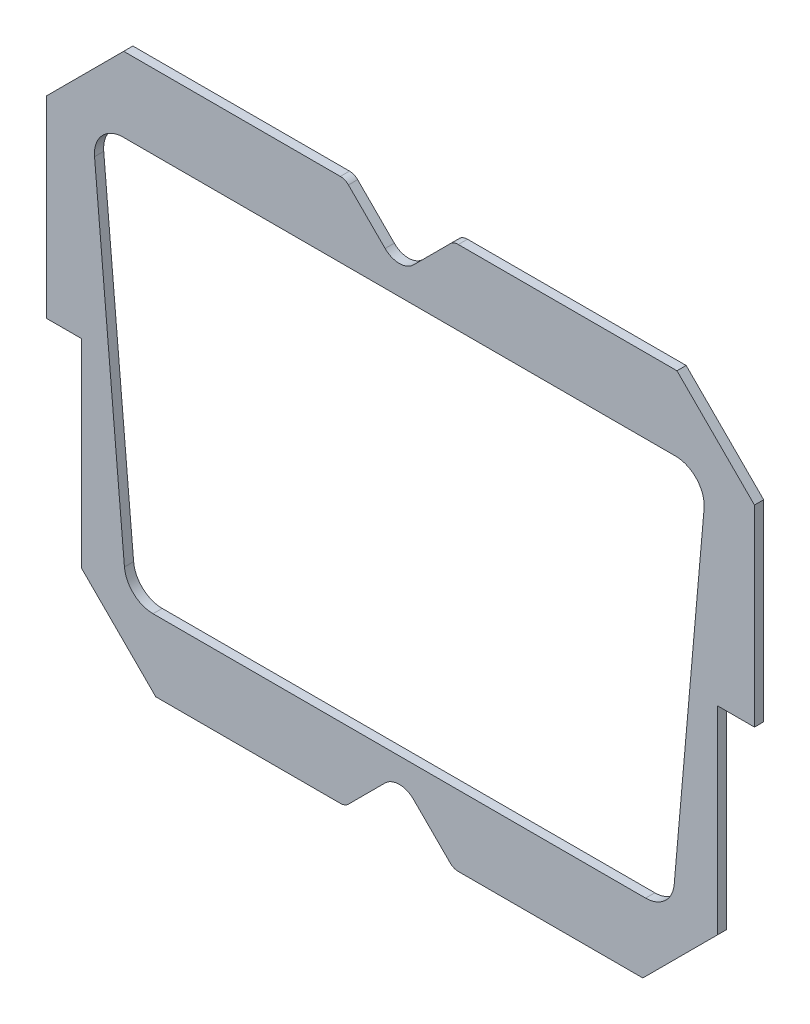
ISO-10303-21;
HEADER;
FILE_DESCRIPTION(('STEP AP214'),'2;1');
FILE_NAME('part.step','',(''),(''),'','','');
FILE_SCHEMA(('AUTOMOTIVE_DESIGN { 1 0 10303 214 1 1 1 1 }'));
ENDSEC;
DATA;
#1=APPLICATION_CONTEXT('core data for automotive mechanical design processes');
#2=APPLICATION_PROTOCOL_DEFINITION('international standard','automotive_design',2000,#1);
#3=PRODUCT_CONTEXT('',#1,'mechanical');
#4=PRODUCT('Part','Part','',(#3));
#5=PRODUCT_RELATED_PRODUCT_CATEGORY('part','',(#4));
#6=PRODUCT_DEFINITION_FORMATION('','',#4);
#7=PRODUCT_DEFINITION_CONTEXT('part definition',#1,'design');
#8=PRODUCT_DEFINITION('design','',#6,#7);
#9=PRODUCT_DEFINITION_SHAPE('','',#8);
#10=(LENGTH_UNIT() NAMED_UNIT(*) SI_UNIT(.MILLI.,.METRE.));
#11=(NAMED_UNIT(*) PLANE_ANGLE_UNIT() SI_UNIT($,.RADIAN.));
#12=(NAMED_UNIT(*) SI_UNIT($,.STERADIAN.) SOLID_ANGLE_UNIT());
#13=UNCERTAINTY_MEASURE_WITH_UNIT(LENGTH_MEASURE(1.E-05),#10,'distance_accuracy_value','');
#14=(GEOMETRIC_REPRESENTATION_CONTEXT(3) GLOBAL_UNCERTAINTY_ASSIGNED_CONTEXT((#13)) GLOBAL_UNIT_ASSIGNED_CONTEXT((#10,
#11,#12)) REPRESENTATION_CONTEXT('',''));
#15=CARTESIAN_POINT('',(0.,0.,0.));
#16=DIRECTION('',(0.,0.,1.));
#17=DIRECTION('',(1.,0.,0.));
#18=AXIS2_PLACEMENT_3D('',#15,#16,#17);
#19=CARTESIAN_POINT('',(-10.2781745930519,3.74918450862104,1.6));
#20=DIRECTION('',(0.,0.,1.));
#21=DIRECTION('',(1.,0.,0.));
#22=AXIS2_PLACEMENT_3D('',#19,#20,#21);
#23=PLANE('',#22);
#24=DIRECTION('',(-0.707106781186546,-0.707106781186549,0.));
#25=VECTOR('',#24,1.);
#26=CARTESIAN_POINT('',(-48.0233692170678,96.349184508621,1.6));
#27=LINE('',#26,#25);
#28=CARTESIAN_POINT('',(-48.0233692170678,96.349184508621,1.6));
#29=VERTEX_POINT('',#28);
#30=CARTESIAN_POINT('',(-61.5,82.8725537256888,1.6));
#31=VERTEX_POINT('',#30);
#32=EDGE_CURVE('E353',#29,#31,#27,.T.);
#33=ORIENTED_EDGE('',*,*,#32,.T.);
#34=DIRECTION('',(0.,-1.,0.));
#35=VECTOR('',#34,1.);
#36=CARTESIAN_POINT('',(-61.5,49.3283966203936,1.6));
#37=LINE('',#36,#35);
#38=CARTESIAN_POINT('',(-61.5,49.3283966203936,1.6));
#39=VERTEX_POINT('',#38);
#40=EDGE_CURVE('E356',#31,#39,#37,.T.);
#41=ORIENTED_EDGE('',*,*,#40,.T.);
#42=DIRECTION('',(1.,0.,0.));
#43=VECTOR('',#42,1.);
#44=CARTESIAN_POINT('',(-61.5,49.3283966203936,1.6));
#45=LINE('',#44,#43);
#46=CARTESIAN_POINT('',(-55.4,49.3283966203936,1.6));
#47=VERTEX_POINT('',#46);
#48=EDGE_CURVE('E358',#39,#47,#45,.T.);
#49=ORIENTED_EDGE('',*,*,#48,.T.);
#50=DIRECTION('',(0.,-1.,0.));
#51=VECTOR('',#50,1.);
#52=CARTESIAN_POINT('',(-55.4,14.7206299155402,1.6));
#53=LINE('',#52,#51);
#54=CARTESIAN_POINT('',(-55.4,14.7206299155402,1.6));
#55=VERTEX_POINT('',#54);
#56=EDGE_CURVE('E360',#47,#55,#53,.T.);
#57=ORIENTED_EDGE('',*,*,#56,.T.);
#58=DIRECTION('',(0.707106781186544,-0.707106781186551,0.));
#59=VECTOR('',#58,1.);
#60=CARTESIAN_POINT('',(-42.4285545930809,1.74918450862104,1.6));
#61=LINE('',#60,#59);
#62=CARTESIAN_POINT('',(-42.4285545930809,1.74918450862104,1.6));
#63=VERTEX_POINT('',#62);
#64=EDGE_CURVE('E362',#55,#63,#61,.T.);
#65=ORIENTED_EDGE('',*,*,#64,.T.);
#66=DIRECTION('',(1.,0.,0.));
#67=VECTOR('',#66,1.);
#68=CARTESIAN_POINT('',(-42.4285545930809,1.74918450862104,1.6));
#69=LINE('',#68,#67);
#70=CARTESIAN_POINT('',(-10.2781745930519,1.74918450862104,1.6));
#71=VERTEX_POINT('',#70);
#72=EDGE_CURVE('E364',#63,#71,#69,.T.);
#73=ORIENTED_EDGE('',*,*,#72,.T.);
#74=CARTESIAN_POINT('',(-10.2781745930519,3.74918450862104,1.6));
#75=DIRECTION('',(0.,0.,1.));
#76=DIRECTION('',(1.,0.,0.));
#77=AXIS2_PLACEMENT_3D('',#74,#75,#76);
#78=CIRCLE('',#77,2.);
#79=CARTESIAN_POINT('',(-8.86396103067884,2.33497094624796,1.6));
#80=VERTEX_POINT('',#79);
#81=EDGE_CURVE('E366',#71,#80,#78,.T.);
#82=ORIENTED_EDGE('',*,*,#81,.T.);
#83=DIRECTION('',(0.707106781186544,0.707106781186551,0.));
#84=VECTOR('',#83,1.);
#85=CARTESIAN_POINT('',(-8.86396103067884,2.33497094624796,1.6));
#86=LINE('',#85,#84);
#87=CARTESIAN_POINT('',(-2.47487373415292,8.72405824277394,1.6));
#88=VERTEX_POINT('',#87);
#89=EDGE_CURVE('E368',#80,#88,#86,.T.);
#90=ORIENTED_EDGE('',*,*,#89,.T.);
#91=CARTESIAN_POINT('',(0.,6.24918450862104,1.6));
#92=DIRECTION('',(0.,0.,-1.));
#93=DIRECTION('',(-1.,0.,0.));
#94=AXIS2_PLACEMENT_3D('',#91,#92,#93);
#95=CIRCLE('',#94,3.49999999999999);
#96=CARTESIAN_POINT('',(2.47487373415292,8.72405824277395,1.6));
#97=VERTEX_POINT('',#96);
#98=EDGE_CURVE('E370',#88,#97,#95,.T.);
#99=ORIENTED_EDGE('',*,*,#98,.T.);
#100=DIRECTION('',(0.707106781186544,-0.707106781186551,0.));
#101=VECTOR('',#100,1.);
#102=CARTESIAN_POINT('',(8.86396103067884,2.33497094624796,1.6));
#103=LINE('',#102,#101);
#104=CARTESIAN_POINT('',(8.86396103067884,2.33497094624796,1.6));
#105=VERTEX_POINT('',#104);
#106=EDGE_CURVE('E372',#97,#105,#103,.T.);
#107=ORIENTED_EDGE('',*,*,#106,.T.);
#108=CARTESIAN_POINT('',(10.2781745930519,3.74918450862104,1.6));
#109=DIRECTION('',(0.,0.,1.));
#110=DIRECTION('',(-1.,0.,0.));
#111=AXIS2_PLACEMENT_3D('',#108,#109,#110);
#112=CIRCLE('',#111,2.);
#113=CARTESIAN_POINT('',(10.2781745930519,1.74918450862104,1.6));
#114=VERTEX_POINT('',#113);
#115=EDGE_CURVE('E374',#105,#114,#112,.T.);
#116=ORIENTED_EDGE('',*,*,#115,.T.);
#117=DIRECTION('',(1.,0.,0.));
#118=VECTOR('',#117,1.);
#119=CARTESIAN_POINT('',(10.2781745930519,1.74918450862104,1.6));
#120=LINE('',#119,#118);
#121=CARTESIAN_POINT('',(42.4216698309266,1.74918450862104,1.6));
#122=VERTEX_POINT('',#121);
#123=EDGE_CURVE('E376',#114,#122,#120,.T.);
#124=ORIENTED_EDGE('',*,*,#123,.T.);
#125=DIRECTION('',(0.707106781186551,0.707106781186544,0.));
#126=VECTOR('',#125,1.);
#127=CARTESIAN_POINT('',(55.4,14.7275146776944,1.6));
#128=LINE('',#127,#126);
#129=CARTESIAN_POINT('',(55.4,14.7275146776944,1.6));
#130=VERTEX_POINT('',#129);
#131=EDGE_CURVE('E378',#122,#130,#128,.T.);
#132=ORIENTED_EDGE('',*,*,#131,.T.);
#133=DIRECTION('',(0.,1.,0.));
#134=VECTOR('',#133,1.);
#135=CARTESIAN_POINT('',(55.4,49.3283966203936,1.6));
#136=LINE('',#135,#134);
#137=CARTESIAN_POINT('',(55.4,49.3283966203936,1.6));
#138=VERTEX_POINT('',#137);
#139=EDGE_CURVE('E380',#130,#138,#136,.T.);
#140=ORIENTED_EDGE('',*,*,#139,.T.);
#141=DIRECTION('',(1.,0.,0.));
#142=VECTOR('',#141,1.);
#143=CARTESIAN_POINT('',(61.8798676559229,49.3283966203936,1.6));
#144=LINE('',#143,#142);
#145=CARTESIAN_POINT('',(61.8798676559229,49.3283966203936,1.6));
#146=VERTEX_POINT('',#145);
#147=EDGE_CURVE('E382',#138,#146,#144,.T.);
#148=ORIENTED_EDGE('',*,*,#147,.T.);
#149=DIRECTION('',(0.,1.,0.));
#150=VECTOR('',#149,1.);
#151=CARTESIAN_POINT('',(61.8798676559229,82.8392643266023,1.6));
#152=LINE('',#151,#150);
#153=CARTESIAN_POINT('',(61.8798676559229,82.8392643266023,1.6));
#154=VERTEX_POINT('',#153);
#155=EDGE_CURVE('E384',#146,#154,#152,.T.);
#156=ORIENTED_EDGE('',*,*,#155,.T.);
#157=DIRECTION('',(-0.707106781186548,0.707106781186547,0.));
#158=VECTOR('',#157,1.);
#159=CARTESIAN_POINT('',(48.3699474739043,96.349184508621,1.6));
#160=LINE('',#159,#158);
#161=CARTESIAN_POINT('',(48.3699474739043,96.349184508621,1.6));
#162=VERTEX_POINT('',#161);
#163=EDGE_CURVE('E386',#154,#162,#160,.T.);
#164=ORIENTED_EDGE('',*,*,#163,.T.);
#165=DIRECTION('',(-1.,0.,0.));
#166=VECTOR('',#165,1.);
#167=CARTESIAN_POINT('',(10.2781745930521,96.349184508621,1.6));
#168=LINE('',#167,#166);
#169=CARTESIAN_POINT('',(10.2781745930521,96.349184508621,1.6));
#170=VERTEX_POINT('',#169);
#171=EDGE_CURVE('E388',#162,#170,#168,.T.);
#172=ORIENTED_EDGE('',*,*,#171,.T.);
#173=CARTESIAN_POINT('',(10.278174593052,94.349184508621,1.6));
#174=DIRECTION('',(0.,0.,1.));
#175=DIRECTION('',(1.,0.,0.));
#176=AXIS2_PLACEMENT_3D('',#173,#174,#175);
#177=CIRCLE('',#176,2.);
#178=CARTESIAN_POINT('',(8.86396103067895,95.7633980709941,1.6));
#179=VERTEX_POINT('',#178);
#180=EDGE_CURVE('E390',#170,#179,#177,.T.);
#181=ORIENTED_EDGE('',*,*,#180,.T.);
#182=DIRECTION('',(-0.707106781186549,-0.707106781186546,0.));
#183=VECTOR('',#182,1.);
#184=CARTESIAN_POINT('',(8.86396103067895,95.7633980709941,1.6));
#185=LINE('',#184,#183);
#186=CARTESIAN_POINT('',(2.47487373415291,89.3743107744681,1.6));
#187=VERTEX_POINT('',#186);
#188=EDGE_CURVE('E392',#179,#187,#185,.T.);
#189=ORIENTED_EDGE('',*,*,#188,.T.);
#190=CARTESIAN_POINT('',(0.,91.849184508621,1.6));
#191=DIRECTION('',(0.,0.,-1.));
#192=DIRECTION('',(1.,0.,0.));
#193=AXIS2_PLACEMENT_3D('',#190,#191,#192);
#194=CIRCLE('',#193,3.5);
#195=CARTESIAN_POINT('',(-2.47487373415292,89.3743107744681,1.6));
#196=VERTEX_POINT('',#195);
#197=EDGE_CURVE('E394',#187,#196,#194,.T.);
#198=ORIENTED_EDGE('',*,*,#197,.T.);
#199=DIRECTION('',(-0.707106781186549,0.707106781186546,0.));
#200=VECTOR('',#199,1.);
#201=CARTESIAN_POINT('',(-8.86396103067895,95.7633980709941,1.6));
#202=LINE('',#201,#200);
#203=CARTESIAN_POINT('',(-8.86396103067895,95.7633980709941,1.6));
#204=VERTEX_POINT('',#203);
#205=EDGE_CURVE('E396',#196,#204,#202,.T.);
#206=ORIENTED_EDGE('',*,*,#205,.T.);
#207=CARTESIAN_POINT('',(-10.278174593052,94.349184508621,1.6));
#208=DIRECTION('',(0.,0.,1.));
#209=DIRECTION('',(1.,0.,0.));
#210=AXIS2_PLACEMENT_3D('',#207,#208,#209);
#211=CIRCLE('',#210,2.);
#212=CARTESIAN_POINT('',(-10.2781745930521,96.349184508621,1.6));
#213=VERTEX_POINT('',#212);
#214=EDGE_CURVE('E398',#204,#213,#211,.T.);
#215=ORIENTED_EDGE('',*,*,#214,.T.);
#216=DIRECTION('',(-1.,0.,0.));
#217=VECTOR('',#216,1.);
#218=CARTESIAN_POINT('',(-48.0233692170678,96.349184508621,1.6));
#219=LINE('',#218,#217);
#220=EDGE_CURVE('E400',#213,#29,#219,.T.);
#221=ORIENTED_EDGE('',*,*,#220,.T.);
#222=EDGE_LOOP('',(#33,#41,#49,#57,#65,#73,#82,#90,#99,#107,#116,#124,#132,#140,#148,#156,#164,
#172,#181,#189,#198,#206,#215,#221));
#223=FACE_BOUND('',#222,.T.);
#224=DIRECTION('',(-1.,0.,0.));
#225=VECTOR('',#224,1.);
#226=CARTESIAN_POINT('',(-48.1185305352456,83.3491845086211,1.6));
#227=LINE('',#226,#225);
#228=CARTESIAN_POINT('',(48.1185305352456,83.3491845086211,1.6));
#229=VERTEX_POINT('',#228);
#230=CARTESIAN_POINT('',(-48.1185305352456,83.3491845086211,1.6));
#231=VERTEX_POINT('',#230);
#232=EDGE_CURVE('E279',#229,#231,#227,.T.);
#233=ORIENTED_EDGE('',*,*,#232,.F.);
#234=CARTESIAN_POINT('',(48.1185305352456,78.3491845086211,1.6));
#235=DIRECTION('',(0.,0.,1.));
#236=DIRECTION('',(1.,0.,0.));
#237=AXIS2_PLACEMENT_3D('',#234,#235,#236);
#238=CIRCLE('',#237,5.00000000000001);
#239=CARTESIAN_POINT('',(53.0993580347371,77.9117403175408,1.6));
#240=VERTEX_POINT('',#239);
#241=EDGE_CURVE('E256',#240,#229,#238,.T.);
#242=ORIENTED_EDGE('',*,*,#241,.F.);
#243=DIRECTION('',(0.0874888382160483,0.996165499898288,0.));
#244=VECTOR('',#243,1.);
#245=CARTESIAN_POINT('',(53.0993580347371,77.9117403175408,1.6));
#246=LINE('',#245,#244);
#247=CARTESIAN_POINT('',(47.8912996280352,18.6117403175408,1.6));
#248=VERTEX_POINT('',#247);
#249=EDGE_CURVE('E291',#248,#240,#246,.T.);
#250=ORIENTED_EDGE('',*,*,#249,.F.);
#251=CARTESIAN_POINT('',(42.9104721285438,19.0491845086211,1.6));
#252=DIRECTION('',(0.,0.,1.));
#253=DIRECTION('',(1.,0.,0.));
#254=AXIS2_PLACEMENT_3D('',#251,#252,#253);
#255=CIRCLE('',#254,5.);
#256=CARTESIAN_POINT('',(42.9104721285437,14.0491845086211,1.6));
#257=VERTEX_POINT('',#256);
#258=EDGE_CURVE('E289',#257,#248,#255,.T.);
#259=ORIENTED_EDGE('',*,*,#258,.F.);
#260=DIRECTION('',(1.,0.,0.));
#261=VECTOR('',#260,1.);
#262=CARTESIAN_POINT('',(42.9104721285437,14.0491845086211,1.6));
#263=LINE('',#262,#261);
#264=CARTESIAN_POINT('',(-42.9104721285437,14.049184508621,1.6));
#265=VERTEX_POINT('',#264);
#266=EDGE_CURVE('E287',#265,#257,#263,.T.);
#267=ORIENTED_EDGE('',*,*,#266,.F.);
#268=CARTESIAN_POINT('',(-42.9104721285438,19.049184508621,1.6));
#269=DIRECTION('',(0.,0.,1.));
#270=DIRECTION('',(-1.,0.,0.));
#271=AXIS2_PLACEMENT_3D('',#268,#269,#270);
#272=CIRCLE('',#271,5.);
#273=CARTESIAN_POINT('',(-47.8912996280352,18.6117403175408,1.6));
#274=VERTEX_POINT('',#273);
#275=EDGE_CURVE('E285',#274,#265,#272,.T.);
#276=ORIENTED_EDGE('',*,*,#275,.F.);
#277=DIRECTION('',(0.0874888382160483,-0.996165499898288,0.));
#278=VECTOR('',#277,1.);
#279=CARTESIAN_POINT('',(-47.8912996280352,18.6117403175408,1.6));
#280=LINE('',#279,#278);
#281=CARTESIAN_POINT('',(-53.0993580347371,77.9117403175408,1.6));
#282=VERTEX_POINT('',#281);
#283=EDGE_CURVE('E283',#282,#274,#280,.T.);
#284=ORIENTED_EDGE('',*,*,#283,.F.);
#285=CARTESIAN_POINT('',(-48.1185305352457,78.3491845086211,1.6));
#286=DIRECTION('',(0.,0.,1.));
#287=DIRECTION('',(-1.,0.,0.));
#288=AXIS2_PLACEMENT_3D('',#285,#286,#287);
#289=CIRCLE('',#288,5.);
#290=EDGE_CURVE('E281',#231,#282,#289,.T.);
#291=ORIENTED_EDGE('',*,*,#290,.F.);
#292=EDGE_LOOP('',(#233,#242,#250,#259,#267,#276,#284,#291));
#293=FACE_BOUND('',#292,.T.);
#294=ADVANCED_FACE('F32',(#223,#293),#23,.T.);
#295=CARTESIAN_POINT('',(-10.2781745930519,3.74918450862104,0.));
#296=DIRECTION('',(0.,0.,1.));
#297=DIRECTION('',(1.,0.,0.));
#298=AXIS2_PLACEMENT_3D('',#295,#296,#297);
#299=PLANE('',#298);
#300=DIRECTION('',(-0.707106781186546,-0.707106781186549,0.));
#301=VECTOR('',#300,1.);
#302=CARTESIAN_POINT('',(-48.0233692170678,96.349184508621,0.));
#303=LINE('',#302,#301);
#304=CARTESIAN_POINT('',(-48.0233692170678,96.349184508621,0.));
#305=VERTEX_POINT('',#304);
#306=CARTESIAN_POINT('',(-61.5,82.8725537256888,0.));
#307=VERTEX_POINT('',#306);
#308=EDGE_CURVE('E257',#305,#307,#303,.T.);
#309=ORIENTED_EDGE('',*,*,#308,.F.);
#310=DIRECTION('',(-1.,0.,0.));
#311=VECTOR('',#310,1.);
#312=CARTESIAN_POINT('',(-48.0233692170678,96.349184508621,0.));
#313=LINE('',#312,#311);
#314=CARTESIAN_POINT('',(-10.2781745930521,96.349184508621,0.));
#315=VERTEX_POINT('',#314);
#316=EDGE_CURVE('E351',#315,#305,#313,.T.);
#317=ORIENTED_EDGE('',*,*,#316,.F.);
#318=CARTESIAN_POINT('',(-10.278174593052,94.349184508621,0.));
#319=DIRECTION('',(0.,0.,1.));
#320=DIRECTION('',(1.,0.,0.));
#321=AXIS2_PLACEMENT_3D('',#318,#319,#320);
#322=CIRCLE('',#321,2.);
#323=CARTESIAN_POINT('',(-8.86396103067895,95.7633980709941,0.));
#324=VERTEX_POINT('',#323);
#325=EDGE_CURVE('E349',#324,#315,#322,.T.);
#326=ORIENTED_EDGE('',*,*,#325,.F.);
#327=DIRECTION('',(-0.707106781186549,0.707106781186546,0.));
#328=VECTOR('',#327,1.);
#329=CARTESIAN_POINT('',(-8.86396103067895,95.7633980709941,0.));
#330=LINE('',#329,#328);
#331=CARTESIAN_POINT('',(-2.47487373415292,89.3743107744681,0.));
#332=VERTEX_POINT('',#331);
#333=EDGE_CURVE('E347',#332,#324,#330,.T.);
#334=ORIENTED_EDGE('',*,*,#333,.F.);
#335=CARTESIAN_POINT('',(0.,91.849184508621,0.));
#336=DIRECTION('',(0.,0.,-1.));
#337=DIRECTION('',(1.,0.,0.));
#338=AXIS2_PLACEMENT_3D('',#335,#336,#337);
#339=CIRCLE('',#338,3.5);
#340=CARTESIAN_POINT('',(2.47487373415291,89.3743107744681,0.));
#341=VERTEX_POINT('',#340);
#342=EDGE_CURVE('E345',#341,#332,#339,.T.);
#343=ORIENTED_EDGE('',*,*,#342,.F.);
#344=DIRECTION('',(-0.707106781186549,-0.707106781186546,0.));
#345=VECTOR('',#344,1.);
#346=CARTESIAN_POINT('',(8.86396103067895,95.7633980709941,0.));
#347=LINE('',#346,#345);
#348=CARTESIAN_POINT('',(8.86396103067895,95.7633980709941,0.));
#349=VERTEX_POINT('',#348);
#350=EDGE_CURVE('E343',#349,#341,#347,.T.);
#351=ORIENTED_EDGE('',*,*,#350,.F.);
#352=CARTESIAN_POINT('',(10.278174593052,94.349184508621,0.));
#353=DIRECTION('',(0.,0.,1.));
#354=DIRECTION('',(1.,0.,0.));
#355=AXIS2_PLACEMENT_3D('',#352,#353,#354);
#356=CIRCLE('',#355,2.);
#357=CARTESIAN_POINT('',(10.2781745930521,96.349184508621,0.));
#358=VERTEX_POINT('',#357);
#359=EDGE_CURVE('E341',#358,#349,#356,.T.);
#360=ORIENTED_EDGE('',*,*,#359,.F.);
#361=DIRECTION('',(-1.,0.,0.));
#362=VECTOR('',#361,1.);
#363=CARTESIAN_POINT('',(10.2781745930521,96.349184508621,0.));
#364=LINE('',#363,#362);
#365=CARTESIAN_POINT('',(48.3699474739043,96.349184508621,0.));
#366=VERTEX_POINT('',#365);
#367=EDGE_CURVE('E339',#366,#358,#364,.T.);
#368=ORIENTED_EDGE('',*,*,#367,.F.);
#369=DIRECTION('',(-0.707106781186548,0.707106781186547,0.));
#370=VECTOR('',#369,1.);
#371=CARTESIAN_POINT('',(48.3699474739043,96.349184508621,0.));
#372=LINE('',#371,#370);
#373=CARTESIAN_POINT('',(61.8798676559229,82.8392643266023,0.));
#374=VERTEX_POINT('',#373);
#375=EDGE_CURVE('E337',#374,#366,#372,.T.);
#376=ORIENTED_EDGE('',*,*,#375,.F.);
#377=DIRECTION('',(0.,1.,0.));
#378=VECTOR('',#377,1.);
#379=CARTESIAN_POINT('',(61.8798676559229,82.8392643266023,0.));
#380=LINE('',#379,#378);
#381=CARTESIAN_POINT('',(61.8798676559229,49.3283966203936,0.));
#382=VERTEX_POINT('',#381);
#383=EDGE_CURVE('E335',#382,#374,#380,.T.);
#384=ORIENTED_EDGE('',*,*,#383,.F.);
#385=DIRECTION('',(1.,0.,0.));
#386=VECTOR('',#385,1.);
#387=CARTESIAN_POINT('',(61.8798676559229,49.3283966203936,0.));
#388=LINE('',#387,#386);
#389=CARTESIAN_POINT('',(55.4,49.3283966203936,0.));
#390=VERTEX_POINT('',#389);
#391=EDGE_CURVE('E333',#390,#382,#388,.T.);
#392=ORIENTED_EDGE('',*,*,#391,.F.);
#393=DIRECTION('',(0.,1.,0.));
#394=VECTOR('',#393,1.);
#395=CARTESIAN_POINT('',(55.4,49.3283966203936,0.));
#396=LINE('',#395,#394);
#397=CARTESIAN_POINT('',(55.4,14.7275146776944,0.));
#398=VERTEX_POINT('',#397);
#399=EDGE_CURVE('E331',#398,#390,#396,.T.);
#400=ORIENTED_EDGE('',*,*,#399,.F.);
#401=DIRECTION('',(0.707106781186551,0.707106781186544,0.));
#402=VECTOR('',#401,1.);
#403=CARTESIAN_POINT('',(55.4,14.7275146776944,0.));
#404=LINE('',#403,#402);
#405=CARTESIAN_POINT('',(42.4216698309266,1.74918450862104,0.));
#406=VERTEX_POINT('',#405);
#407=EDGE_CURVE('E329',#406,#398,#404,.T.);
#408=ORIENTED_EDGE('',*,*,#407,.F.);
#409=DIRECTION('',(1.,0.,0.));
#410=VECTOR('',#409,1.);
#411=CARTESIAN_POINT('',(10.2781745930519,1.74918450862104,0.));
#412=LINE('',#411,#410);
#413=CARTESIAN_POINT('',(10.2781745930519,1.74918450862104,0.));
#414=VERTEX_POINT('',#413);
#415=EDGE_CURVE('E327',#414,#406,#412,.T.);
#416=ORIENTED_EDGE('',*,*,#415,.F.);
#417=CARTESIAN_POINT('',(10.2781745930519,3.74918450862104,0.));
#418=DIRECTION('',(0.,0.,1.));
#419=DIRECTION('',(-1.,0.,0.));
#420=AXIS2_PLACEMENT_3D('',#417,#418,#419);
#421=CIRCLE('',#420,2.);
#422=CARTESIAN_POINT('',(8.86396103067884,2.33497094624796,0.));
#423=VERTEX_POINT('',#422);
#424=EDGE_CURVE('E325',#423,#414,#421,.T.);
#425=ORIENTED_EDGE('',*,*,#424,.F.);
#426=DIRECTION('',(0.707106781186544,-0.707106781186551,0.));
#427=VECTOR('',#426,1.);
#428=CARTESIAN_POINT('',(8.86396103067884,2.33497094624796,0.));
#429=LINE('',#428,#427);
#430=CARTESIAN_POINT('',(2.47487373415292,8.72405824277395,0.));
#431=VERTEX_POINT('',#430);
#432=EDGE_CURVE('E323',#431,#423,#429,.T.);
#433=ORIENTED_EDGE('',*,*,#432,.F.);
#434=CARTESIAN_POINT('',(0.,6.24918450862104,0.));
#435=DIRECTION('',(0.,0.,-1.));
#436=DIRECTION('',(-1.,0.,0.));
#437=AXIS2_PLACEMENT_3D('',#434,#435,#436);
#438=CIRCLE('',#437,3.49999999999999);
#439=CARTESIAN_POINT('',(-2.47487373415292,8.72405824277394,0.));
#440=VERTEX_POINT('',#439);
#441=EDGE_CURVE('E321',#440,#431,#438,.T.);
#442=ORIENTED_EDGE('',*,*,#441,.F.);
#443=DIRECTION('',(0.707106781186544,0.707106781186551,0.));
#444=VECTOR('',#443,1.);
#445=CARTESIAN_POINT('',(-8.86396103067884,2.33497094624796,0.));
#446=LINE('',#445,#444);
#447=CARTESIAN_POINT('',(-8.86396103067884,2.33497094624796,0.));
#448=VERTEX_POINT('',#447);
#449=EDGE_CURVE('E319',#448,#440,#446,.T.);
#450=ORIENTED_EDGE('',*,*,#449,.F.);
#451=CARTESIAN_POINT('',(-10.2781745930519,3.74918450862104,0.));
#452=DIRECTION('',(0.,0.,1.));
#453=DIRECTION('',(1.,0.,0.));
#454=AXIS2_PLACEMENT_3D('',#451,#452,#453);
#455=CIRCLE('',#454,2.);
#456=CARTESIAN_POINT('',(-10.2781745930519,1.74918450862104,0.));
#457=VERTEX_POINT('',#456);
#458=EDGE_CURVE('E317',#457,#448,#455,.T.);
#459=ORIENTED_EDGE('',*,*,#458,.F.);
#460=DIRECTION('',(1.,0.,0.));
#461=VECTOR('',#460,1.);
#462=CARTESIAN_POINT('',(-42.4285545930809,1.74918450862104,0.));
#463=LINE('',#462,#461);
#464=CARTESIAN_POINT('',(-42.4285545930809,1.74918450862104,0.));
#465=VERTEX_POINT('',#464);
#466=EDGE_CURVE('E315',#465,#457,#463,.T.);
#467=ORIENTED_EDGE('',*,*,#466,.F.);
#468=DIRECTION('',(0.707106781186544,-0.707106781186551,0.));
#469=VECTOR('',#468,1.);
#470=CARTESIAN_POINT('',(-42.4285545930809,1.74918450862104,0.));
#471=LINE('',#470,#469);
#472=CARTESIAN_POINT('',(-55.4,14.7206299155402,0.));
#473=VERTEX_POINT('',#472);
#474=EDGE_CURVE('E313',#473,#465,#471,.T.);
#475=ORIENTED_EDGE('',*,*,#474,.F.);
#476=DIRECTION('',(0.,-1.,0.));
#477=VECTOR('',#476,1.);
#478=CARTESIAN_POINT('',(-55.4,14.7206299155402,0.));
#479=LINE('',#478,#477);
#480=CARTESIAN_POINT('',(-55.4,49.3283966203936,0.));
#481=VERTEX_POINT('',#480);
#482=EDGE_CURVE('E311',#481,#473,#479,.T.);
#483=ORIENTED_EDGE('',*,*,#482,.F.);
#484=DIRECTION('',(1.,0.,0.));
#485=VECTOR('',#484,1.);
#486=CARTESIAN_POINT('',(-61.5,49.3283966203936,0.));
#487=LINE('',#486,#485);
#488=CARTESIAN_POINT('',(-61.5,49.3283966203936,0.));
#489=VERTEX_POINT('',#488);
#490=EDGE_CURVE('E309',#489,#481,#487,.T.);
#491=ORIENTED_EDGE('',*,*,#490,.F.);
#492=DIRECTION('',(0.,-1.,0.));
#493=VECTOR('',#492,1.);
#494=CARTESIAN_POINT('',(-61.5,49.3283966203936,0.));
#495=LINE('',#494,#493);
#496=EDGE_CURVE('E307',#307,#489,#495,.T.);
#497=ORIENTED_EDGE('',*,*,#496,.F.);
#498=EDGE_LOOP('',(#309,#317,#326,#334,#343,#351,#360,#368,#376,#384,#392,#400,#408,#416,#425,
#433,#442,#450,#459,#467,#475,#483,#491,#497));
#499=FACE_BOUND('',#498,.T.);
#500=CARTESIAN_POINT('',(48.1185305352456,78.3491845086211,0.));
#501=DIRECTION('',(0.,0.,1.));
#502=DIRECTION('',(1.,0.,0.));
#503=AXIS2_PLACEMENT_3D('',#500,#501,#502);
#504=CIRCLE('',#503,5.00000000000001);
#505=CARTESIAN_POINT('',(53.0993580347371,77.9117403175408,0.));
#506=VERTEX_POINT('',#505);
#507=CARTESIAN_POINT('',(48.1185305352456,83.3491845086211,0.));
#508=VERTEX_POINT('',#507);
#509=EDGE_CURVE('E55',#506,#508,#504,.T.);
#510=ORIENTED_EDGE('',*,*,#509,.T.);
#511=DIRECTION('',(-1.,0.,0.));
#512=VECTOR('',#511,1.);
#513=CARTESIAN_POINT('',(-48.1185305352456,83.3491845086211,0.));
#514=LINE('',#513,#512);
#515=CARTESIAN_POINT('',(-48.1185305352456,83.3491845086211,0.));
#516=VERTEX_POINT('',#515);
#517=EDGE_CURVE('E243',#508,#516,#514,.T.);
#518=ORIENTED_EDGE('',*,*,#517,.T.);
#519=CARTESIAN_POINT('',(-48.1185305352457,78.3491845086211,0.));
#520=DIRECTION('',(0.,0.,1.));
#521=DIRECTION('',(-1.,0.,0.));
#522=AXIS2_PLACEMENT_3D('',#519,#520,#521);
#523=CIRCLE('',#522,5.);
#524=CARTESIAN_POINT('',(-53.0993580347371,77.9117403175408,0.));
#525=VERTEX_POINT('',#524);
#526=EDGE_CURVE('E252',#516,#525,#523,.T.);
#527=ORIENTED_EDGE('',*,*,#526,.T.);
#528=DIRECTION('',(0.0874888382160483,-0.996165499898288,0.));
#529=VECTOR('',#528,1.);
#530=CARTESIAN_POINT('',(-47.8912996280352,18.6117403175408,0.));
#531=LINE('',#530,#529);
#532=CARTESIAN_POINT('',(-47.8912996280352,18.6117403175408,0.));
#533=VERTEX_POINT('',#532);
#534=EDGE_CURVE('E266',#525,#533,#531,.T.);
#535=ORIENTED_EDGE('',*,*,#534,.T.);
#536=CARTESIAN_POINT('',(-42.9104721285438,19.049184508621,0.));
#537=DIRECTION('',(0.,0.,1.));
#538=DIRECTION('',(-1.,0.,0.));
#539=AXIS2_PLACEMENT_3D('',#536,#537,#538);
#540=CIRCLE('',#539,5.);
#541=CARTESIAN_POINT('',(-42.9104721285437,14.049184508621,0.));
#542=VERTEX_POINT('',#541);
#543=EDGE_CURVE('E269',#533,#542,#540,.T.);
#544=ORIENTED_EDGE('',*,*,#543,.T.);
#545=DIRECTION('',(1.,0.,0.));
#546=VECTOR('',#545,1.);
#547=CARTESIAN_POINT('',(42.9104721285437,14.0491845086211,0.));
#548=LINE('',#547,#546);
#549=CARTESIAN_POINT('',(42.9104721285437,14.0491845086211,0.));
#550=VERTEX_POINT('',#549);
#551=EDGE_CURVE('E272',#542,#550,#548,.T.);
#552=ORIENTED_EDGE('',*,*,#551,.T.);
#553=CARTESIAN_POINT('',(42.9104721285438,19.0491845086211,0.));
#554=DIRECTION('',(0.,0.,1.));
#555=DIRECTION('',(1.,0.,0.));
#556=AXIS2_PLACEMENT_3D('',#553,#554,#555);
#557=CIRCLE('',#556,5.);
#558=CARTESIAN_POINT('',(47.8912996280352,18.6117403175408,0.));
#559=VERTEX_POINT('',#558);
#560=EDGE_CURVE('E275',#550,#559,#557,.T.);
#561=ORIENTED_EDGE('',*,*,#560,.T.);
#562=DIRECTION('',(0.0874888382160483,0.996165499898288,0.));
#563=VECTOR('',#562,1.);
#564=CARTESIAN_POINT('',(53.0993580347371,77.9117403175408,0.));
#565=LINE('',#564,#563);
#566=EDGE_CURVE('E262',#559,#506,#565,.T.);
#567=ORIENTED_EDGE('',*,*,#566,.T.);
#568=EDGE_LOOP('',(#510,#518,#527,#535,#544,#552,#561,#567));
#569=FACE_BOUND('',#568,.T.);
#570=ADVANCED_FACE('F260',(#499,#569),#299,.F.);
#571=CARTESIAN_POINT('',(-48.0233692170678,96.349184508621,1.6));
#572=DIRECTION('',(0.707106781186549,-0.707106781186546,0.));
#573=DIRECTION('',(0.707106781186546,0.707106781186549,0.));
#574=AXIS2_PLACEMENT_3D('',#571,#572,#573);
#575=PLANE('',#574);
#576=ORIENTED_EDGE('',*,*,#308,.T.);
#577=DIRECTION('',(0.,0.,-1.));
#578=VECTOR('',#577,1.);
#579=CARTESIAN_POINT('',(-61.5,82.8725537256888,1.6));
#580=LINE('',#579,#578);
#581=EDGE_CURVE('E11',#31,#307,#580,.T.);
#582=ORIENTED_EDGE('',*,*,#581,.F.);
#583=ORIENTED_EDGE('',*,*,#32,.F.);
#584=DIRECTION('',(0.,0.,-1.));
#585=VECTOR('',#584,1.);
#586=CARTESIAN_POINT('',(-48.0233692170678,96.349184508621,1.6));
#587=LINE('',#586,#585);
#588=EDGE_CURVE('E402',#29,#305,#587,.T.);
#589=ORIENTED_EDGE('',*,*,#588,.T.);
#590=EDGE_LOOP('',(#576,#582,#583,#589));
#591=FACE_BOUND('',#590,.T.);
#592=ADVANCED_FACE('F34',(#591),#575,.F.);
#593=CARTESIAN_POINT('',(-61.5,49.3283966203936,1.6));
#594=DIRECTION('',(1.,0.,0.));
#595=DIRECTION('',(0.,0.,-1.));
#596=AXIS2_PLACEMENT_3D('',#593,#594,#595);
#597=PLANE('',#596);
#598=ORIENTED_EDGE('',*,*,#496,.T.);
#599=DIRECTION('',(0.,0.,-1.));
#600=VECTOR('',#599,1.);
#601=CARTESIAN_POINT('',(-61.5,49.3283966203936,1.6));
#602=LINE('',#601,#600);
#603=EDGE_CURVE('E40',#39,#489,#602,.T.);
#604=ORIENTED_EDGE('',*,*,#603,.F.);
#605=ORIENTED_EDGE('',*,*,#40,.F.);
#606=ORIENTED_EDGE('',*,*,#581,.T.);
#607=EDGE_LOOP('',(#598,#604,#605,#606));
#608=FACE_BOUND('',#607,.T.);
#609=ADVANCED_FACE('F494',(#608),#597,.F.);
#610=CARTESIAN_POINT('',(-61.5,49.3283966203936,1.6));
#611=DIRECTION('',(0.,1.,0.));
#612=DIRECTION('',(0.,0.,1.));
#613=AXIS2_PLACEMENT_3D('',#610,#611,#612);
#614=PLANE('',#613);
#615=ORIENTED_EDGE('',*,*,#490,.T.);
#616=DIRECTION('',(0.,0.,-1.));
#617=VECTOR('',#616,1.);
#618=CARTESIAN_POINT('',(-55.4,49.3283966203936,1.6));
#619=LINE('',#618,#617);
#620=EDGE_CURVE('E465',#47,#481,#619,.T.);
#621=ORIENTED_EDGE('',*,*,#620,.F.);
#622=ORIENTED_EDGE('',*,*,#48,.F.);
#623=ORIENTED_EDGE('',*,*,#603,.T.);
#624=EDGE_LOOP('',(#615,#621,#622,#623));
#625=FACE_BOUND('',#624,.T.);
#626=ADVANCED_FACE('F472',(#625),#614,.F.);
#627=CARTESIAN_POINT('',(-55.4,14.7206299155402,1.6));
#628=DIRECTION('',(1.,0.,0.));
#629=DIRECTION('',(0.,0.,-1.));
#630=AXIS2_PLACEMENT_3D('',#627,#628,#629);
#631=PLANE('',#630);
#632=ORIENTED_EDGE('',*,*,#482,.T.);
#633=DIRECTION('',(0.,0.,-1.));
#634=VECTOR('',#633,1.);
#635=CARTESIAN_POINT('',(-55.4,14.7206299155402,1.6));
#636=LINE('',#635,#634);
#637=EDGE_CURVE('E462',#55,#473,#636,.T.);
#638=ORIENTED_EDGE('',*,*,#637,.F.);
#639=ORIENTED_EDGE('',*,*,#56,.F.);
#640=ORIENTED_EDGE('',*,*,#620,.T.);
#641=EDGE_LOOP('',(#632,#638,#639,#640));
#642=FACE_BOUND('',#641,.T.);
#643=ADVANCED_FACE('F482',(#642),#631,.F.);
#644=CARTESIAN_POINT('',(-42.4285545930809,1.74918450862104,1.6));
#645=DIRECTION('',(0.707106781186551,0.707106781186544,0.));
#646=DIRECTION('',(-0.707106781186544,0.707106781186551,0.));
#647=AXIS2_PLACEMENT_3D('',#644,#645,#646);
#648=PLANE('',#647);
#649=ORIENTED_EDGE('',*,*,#474,.T.);
#650=DIRECTION('',(0.,0.,-1.));
#651=VECTOR('',#650,1.);
#652=CARTESIAN_POINT('',(-42.4285545930809,1.74918450862104,1.6));
#653=LINE('',#652,#651);
#654=EDGE_CURVE('E459',#63,#465,#653,.T.);
#655=ORIENTED_EDGE('',*,*,#654,.F.);
#656=ORIENTED_EDGE('',*,*,#64,.F.);
#657=ORIENTED_EDGE('',*,*,#637,.T.);
#658=EDGE_LOOP('',(#649,#655,#656,#657));
#659=FACE_BOUND('',#658,.T.);
#660=ADVANCED_FACE('F486',(#659),#648,.F.);
#661=CARTESIAN_POINT('',(-42.4285545930809,1.74918450862104,1.6));
#662=DIRECTION('',(0.,1.,0.));
#663=DIRECTION('',(-1.,0.,0.));
#664=AXIS2_PLACEMENT_3D('',#661,#662,#663);
#665=PLANE('',#664);
#666=ORIENTED_EDGE('',*,*,#466,.T.);
#667=DIRECTION('',(0.,0.,-1.));
#668=VECTOR('',#667,1.);
#669=CARTESIAN_POINT('',(-10.2781745930519,1.74918450862104,1.6));
#670=LINE('',#669,#668);
#671=EDGE_CURVE('E456',#71,#457,#670,.T.);
#672=ORIENTED_EDGE('',*,*,#671,.F.);
#673=ORIENTED_EDGE('',*,*,#72,.F.);
#674=ORIENTED_EDGE('',*,*,#654,.T.);
#675=EDGE_LOOP('',(#666,#672,#673,#674));
#676=FACE_BOUND('',#675,.T.);
#677=ADVANCED_FACE('F587',(#676),#665,.F.);
#678=CARTESIAN_POINT('',(-10.2781745930519,3.74918450862104,1.6));
#679=DIRECTION('',(0.,0.,-1.));
#680=DIRECTION('',(-1.,0.,0.));
#681=AXIS2_PLACEMENT_3D('',#678,#679,#680);
#682=CYLINDRICAL_SURFACE('',#681,2.);
#683=ORIENTED_EDGE('',*,*,#458,.T.);
#684=DIRECTION('',(0.,0.,-1.));
#685=VECTOR('',#684,1.);
#686=CARTESIAN_POINT('',(-8.86396103067884,2.33497094624796,1.6));
#687=LINE('',#686,#685);
#688=EDGE_CURVE('E453',#80,#448,#687,.T.);
#689=ORIENTED_EDGE('',*,*,#688,.F.);
#690=ORIENTED_EDGE('',*,*,#81,.F.);
#691=ORIENTED_EDGE('',*,*,#671,.T.);
#692=EDGE_LOOP('',(#683,#689,#690,#691));
#693=FACE_BOUND('',#692,.T.);
#694=ADVANCED_FACE('F585',(#693),#682,.T.);
#695=CARTESIAN_POINT('',(-8.86396103067884,2.33497094624796,1.6));
#696=DIRECTION('',(-0.707106781186551,0.707106781186544,0.));
#697=DIRECTION('',(-0.707106781186544,-0.707106781186551,0.));
#698=AXIS2_PLACEMENT_3D('',#695,#696,#697);
#699=PLANE('',#698);
#700=ORIENTED_EDGE('',*,*,#449,.T.);
#701=DIRECTION('',(0.,0.,-1.));
#702=VECTOR('',#701,1.);
#703=CARTESIAN_POINT('',(-2.47487373415292,8.72405824277394,1.6));
#704=LINE('',#703,#702);
#705=EDGE_CURVE('E450',#88,#440,#704,.T.);
#706=ORIENTED_EDGE('',*,*,#705,.F.);
#707=ORIENTED_EDGE('',*,*,#89,.F.);
#708=ORIENTED_EDGE('',*,*,#688,.T.);
#709=EDGE_LOOP('',(#700,#706,#707,#708));
#710=FACE_BOUND('',#709,.T.);
#711=ADVANCED_FACE('F581',(#710),#699,.F.);
#712=CARTESIAN_POINT('',(0.,6.24918450862104,1.6));
#713=DIRECTION('',(0.,0.,-1.));
#714=DIRECTION('',(-1.,0.,0.));
#715=AXIS2_PLACEMENT_3D('',#712,#713,#714);
#716=CYLINDRICAL_SURFACE('',#715,3.49999999999999);
#717=ORIENTED_EDGE('',*,*,#441,.T.);
#718=DIRECTION('',(0.,0.,-1.));
#719=VECTOR('',#718,1.);
#720=CARTESIAN_POINT('',(2.47487373415292,8.72405824277395,1.6));
#721=LINE('',#720,#719);
#722=EDGE_CURVE('E447',#97,#431,#721,.T.);
#723=ORIENTED_EDGE('',*,*,#722,.F.);
#724=ORIENTED_EDGE('',*,*,#98,.F.);
#725=ORIENTED_EDGE('',*,*,#705,.T.);
#726=EDGE_LOOP('',(#717,#723,#724,#725));
#727=FACE_BOUND('',#726,.T.);
#728=ADVANCED_FACE('F576',(#727),#716,.F.);
#729=CARTESIAN_POINT('',(8.86396103067884,2.33497094624796,1.6));
#730=DIRECTION('',(0.707106781186551,0.707106781186544,0.));
#731=DIRECTION('',(-0.707106781186544,0.707106781186551,0.));
#732=AXIS2_PLACEMENT_3D('',#729,#730,#731);
#733=PLANE('',#732);
#734=ORIENTED_EDGE('',*,*,#432,.T.);
#735=DIRECTION('',(0.,0.,-1.));
#736=VECTOR('',#735,1.);
#737=CARTESIAN_POINT('',(8.86396103067884,2.33497094624796,1.6));
#738=LINE('',#737,#736);
#739=EDGE_CURVE('E444',#105,#423,#738,.T.);
#740=ORIENTED_EDGE('',*,*,#739,.F.);
#741=ORIENTED_EDGE('',*,*,#106,.F.);
#742=ORIENTED_EDGE('',*,*,#722,.T.);
#743=EDGE_LOOP('',(#734,#740,#741,#742));
#744=FACE_BOUND('',#743,.T.);
#745=ADVANCED_FACE('F570',(#744),#733,.F.);
#746=CARTESIAN_POINT('',(10.2781745930519,3.74918450862104,1.6));
#747=DIRECTION('',(0.,0.,-1.));
#748=DIRECTION('',(-1.,0.,0.));
#749=AXIS2_PLACEMENT_3D('',#746,#747,#748);
#750=CYLINDRICAL_SURFACE('',#749,2.);
#751=ORIENTED_EDGE('',*,*,#424,.T.);
#752=DIRECTION('',(0.,0.,-1.));
#753=VECTOR('',#752,1.);
#754=CARTESIAN_POINT('',(10.2781745930519,1.74918450862104,1.6));
#755=LINE('',#754,#753);
#756=EDGE_CURVE('E441',#114,#414,#755,.T.);
#757=ORIENTED_EDGE('',*,*,#756,.F.);
#758=ORIENTED_EDGE('',*,*,#115,.F.);
#759=ORIENTED_EDGE('',*,*,#739,.T.);
#760=EDGE_LOOP('',(#751,#757,#758,#759));
#761=FACE_BOUND('',#760,.T.);
#762=ADVANCED_FACE('F566',(#761),#750,.T.);
#763=CARTESIAN_POINT('',(10.2781745930519,1.74918450862104,1.6));
#764=DIRECTION('',(0.,1.,0.));
#765=DIRECTION('',(-1.,0.,0.));
#766=AXIS2_PLACEMENT_3D('',#763,#764,#765);
#767=PLANE('',#766);
#768=ORIENTED_EDGE('',*,*,#415,.T.);
#769=DIRECTION('',(0.,0.,-1.));
#770=VECTOR('',#769,1.);
#771=CARTESIAN_POINT('',(42.4216698309266,1.74918450862104,1.6));
#772=LINE('',#771,#770);
#773=EDGE_CURVE('E438',#122,#406,#772,.T.);
#774=ORIENTED_EDGE('',*,*,#773,.F.);
#775=ORIENTED_EDGE('',*,*,#123,.F.);
#776=ORIENTED_EDGE('',*,*,#756,.T.);
#777=EDGE_LOOP('',(#768,#774,#775,#776));
#778=FACE_BOUND('',#777,.T.);
#779=ADVANCED_FACE('F561',(#778),#767,.F.);
#780=CARTESIAN_POINT('',(55.4,14.7275146776944,1.6));
#781=DIRECTION('',(-0.707106781186544,0.707106781186551,0.));
#782=DIRECTION('',(-0.707106781186551,-0.707106781186544,0.));
#783=AXIS2_PLACEMENT_3D('',#780,#781,#782);
#784=PLANE('',#783);
#785=ORIENTED_EDGE('',*,*,#407,.T.);
#786=DIRECTION('',(0.,0.,-1.));
#787=VECTOR('',#786,1.);
#788=CARTESIAN_POINT('',(55.4,14.7275146776944,1.6));
#789=LINE('',#788,#787);
#790=EDGE_CURVE('E435',#130,#398,#789,.T.);
#791=ORIENTED_EDGE('',*,*,#790,.F.);
#792=ORIENTED_EDGE('',*,*,#131,.F.);
#793=ORIENTED_EDGE('',*,*,#773,.T.);
#794=EDGE_LOOP('',(#785,#791,#792,#793));
#795=FACE_BOUND('',#794,.T.);
#796=ADVANCED_FACE('F555',(#795),#784,.F.);
#797=CARTESIAN_POINT('',(55.4,49.3283966203936,1.6));
#798=DIRECTION('',(-1.,0.,0.));
#799=DIRECTION('',(0.,-1.,0.));
#800=AXIS2_PLACEMENT_3D('',#797,#798,#799);
#801=PLANE('',#800);
#802=ORIENTED_EDGE('',*,*,#399,.T.);
#803=DIRECTION('',(0.,0.,-1.));
#804=VECTOR('',#803,1.);
#805=CARTESIAN_POINT('',(55.4,49.3283966203936,1.6));
#806=LINE('',#805,#804);
#807=EDGE_CURVE('E432',#138,#390,#806,.T.);
#808=ORIENTED_EDGE('',*,*,#807,.F.);
#809=ORIENTED_EDGE('',*,*,#139,.F.);
#810=ORIENTED_EDGE('',*,*,#790,.T.);
#811=EDGE_LOOP('',(#802,#808,#809,#810));
#812=FACE_BOUND('',#811,.T.);
#813=ADVANCED_FACE('F551',(#812),#801,.F.);
#814=CARTESIAN_POINT('',(61.8798676559229,49.3283966203936,1.6));
#815=DIRECTION('',(0.,1.,0.));
#816=DIRECTION('',(0.,0.,1.));
#817=AXIS2_PLACEMENT_3D('',#814,#815,#816);
#818=PLANE('',#817);
#819=ORIENTED_EDGE('',*,*,#391,.T.);
#820=DIRECTION('',(0.,0.,-1.));
#821=VECTOR('',#820,1.);
#822=CARTESIAN_POINT('',(61.8798676559229,49.3283966203936,1.6));
#823=LINE('',#822,#821);
#824=EDGE_CURVE('E429',#146,#382,#823,.T.);
#825=ORIENTED_EDGE('',*,*,#824,.F.);
#826=ORIENTED_EDGE('',*,*,#147,.F.);
#827=ORIENTED_EDGE('',*,*,#807,.T.);
#828=EDGE_LOOP('',(#819,#825,#826,#827));
#829=FACE_BOUND('',#828,.T.);
#830=ADVANCED_FACE('F546',(#829),#818,.F.);
#831=CARTESIAN_POINT('',(61.8798676559229,82.8392643266023,1.6));
#832=DIRECTION('',(-1.,0.,0.));
#833=DIRECTION('',(0.,0.,1.));
#834=AXIS2_PLACEMENT_3D('',#831,#832,#833);
#835=PLANE('',#834);
#836=ORIENTED_EDGE('',*,*,#383,.T.);
#837=DIRECTION('',(0.,0.,-1.));
#838=VECTOR('',#837,1.);
#839=CARTESIAN_POINT('',(61.8798676559229,82.8392643266023,1.6));
#840=LINE('',#839,#838);
#841=EDGE_CURVE('E426',#154,#374,#840,.T.);
#842=ORIENTED_EDGE('',*,*,#841,.F.);
#843=ORIENTED_EDGE('',*,*,#155,.F.);
#844=ORIENTED_EDGE('',*,*,#824,.T.);
#845=EDGE_LOOP('',(#836,#842,#843,#844));
#846=FACE_BOUND('',#845,.T.);
#847=ADVANCED_FACE('F540',(#846),#835,.F.);
#848=CARTESIAN_POINT('',(48.3699474739043,96.349184508621,1.6));
#849=DIRECTION('',(-0.707106781186547,-0.707106781186548,0.));
#850=DIRECTION('',(0.707106781186548,-0.707106781186547,0.));
#851=AXIS2_PLACEMENT_3D('',#848,#849,#850);
#852=PLANE('',#851);
#853=ORIENTED_EDGE('',*,*,#375,.T.);
#854=DIRECTION('',(0.,0.,-1.));
#855=VECTOR('',#854,1.);
#856=CARTESIAN_POINT('',(48.3699474739043,96.349184508621,1.6));
#857=LINE('',#856,#855);
#858=EDGE_CURVE('E423',#162,#366,#857,.T.);
#859=ORIENTED_EDGE('',*,*,#858,.F.);
#860=ORIENTED_EDGE('',*,*,#163,.F.);
#861=ORIENTED_EDGE('',*,*,#841,.T.);
#862=EDGE_LOOP('',(#853,#859,#860,#861));
#863=FACE_BOUND('',#862,.T.);
#864=ADVANCED_FACE('F536',(#863),#852,.F.);
#865=CARTESIAN_POINT('',(10.2781745930521,96.349184508621,1.6));
#866=DIRECTION('',(0.,-1.,0.));
#867=DIRECTION('',(0.,0.,-1.));
#868=AXIS2_PLACEMENT_3D('',#865,#866,#867);
#869=PLANE('',#868);
#870=ORIENTED_EDGE('',*,*,#367,.T.);
#871=DIRECTION('',(0.,0.,-1.));
#872=VECTOR('',#871,1.);
#873=CARTESIAN_POINT('',(10.2781745930521,96.349184508621,1.6));
#874=LINE('',#873,#872);
#875=EDGE_CURVE('E420',#170,#358,#874,.T.);
#876=ORIENTED_EDGE('',*,*,#875,.F.);
#877=ORIENTED_EDGE('',*,*,#171,.F.);
#878=ORIENTED_EDGE('',*,*,#858,.T.);
#879=EDGE_LOOP('',(#870,#876,#877,#878));
#880=FACE_BOUND('',#879,.T.);
#881=ADVANCED_FACE('F531',(#880),#869,.F.);
#882=CARTESIAN_POINT('',(10.278174593052,94.349184508621,1.6));
#883=DIRECTION('',(0.,0.,-1.));
#884=DIRECTION('',(-1.,0.,0.));
#885=AXIS2_PLACEMENT_3D('',#882,#883,#884);
#886=CYLINDRICAL_SURFACE('',#885,2.);
#887=ORIENTED_EDGE('',*,*,#359,.T.);
#888=DIRECTION('',(0.,0.,-1.));
#889=VECTOR('',#888,1.);
#890=CARTESIAN_POINT('',(8.86396103067895,95.7633980709941,1.6));
#891=LINE('',#890,#889);
#892=EDGE_CURVE('E417',#179,#349,#891,.T.);
#893=ORIENTED_EDGE('',*,*,#892,.F.);
#894=ORIENTED_EDGE('',*,*,#180,.F.);
#895=ORIENTED_EDGE('',*,*,#875,.T.);
#896=EDGE_LOOP('',(#887,#893,#894,#895));
#897=FACE_BOUND('',#896,.T.);
#898=ADVANCED_FACE('F525',(#897),#886,.T.);
#899=CARTESIAN_POINT('',(8.86396103067895,95.7633980709941,1.6));
#900=DIRECTION('',(0.707106781186546,-0.707106781186549,0.));
#901=DIRECTION('',(0.707106781186549,0.707106781186546,0.));
#902=AXIS2_PLACEMENT_3D('',#899,#900,#901);
#903=PLANE('',#902);
#904=ORIENTED_EDGE('',*,*,#350,.T.);
#905=DIRECTION('',(0.,0.,-1.));
#906=VECTOR('',#905,1.);
#907=CARTESIAN_POINT('',(2.47487373415291,89.3743107744681,1.6));
#908=LINE('',#907,#906);
#909=EDGE_CURVE('E414',#187,#341,#908,.T.);
#910=ORIENTED_EDGE('',*,*,#909,.F.);
#911=ORIENTED_EDGE('',*,*,#188,.F.);
#912=ORIENTED_EDGE('',*,*,#892,.T.);
#913=EDGE_LOOP('',(#904,#910,#911,#912));
#914=FACE_BOUND('',#913,.T.);
#915=ADVANCED_FACE('F521',(#914),#903,.F.);
#916=CARTESIAN_POINT('',(0.,91.849184508621,1.6));
#917=DIRECTION('',(0.,0.,-1.));
#918=DIRECTION('',(-1.,0.,0.));
#919=AXIS2_PLACEMENT_3D('',#916,#917,#918);
#920=CYLINDRICAL_SURFACE('',#919,3.5);
#921=ORIENTED_EDGE('',*,*,#342,.T.);
#922=DIRECTION('',(0.,0.,-1.));
#923=VECTOR('',#922,1.);
#924=CARTESIAN_POINT('',(-2.47487373415292,89.3743107744681,1.6));
#925=LINE('',#924,#923);
#926=EDGE_CURVE('E411',#196,#332,#925,.T.);
#927=ORIENTED_EDGE('',*,*,#926,.F.);
#928=ORIENTED_EDGE('',*,*,#197,.F.);
#929=ORIENTED_EDGE('',*,*,#909,.T.);
#930=EDGE_LOOP('',(#921,#927,#928,#929));
#931=FACE_BOUND('',#930,.T.);
#932=ADVANCED_FACE('F516',(#931),#920,.F.);
#933=CARTESIAN_POINT('',(-8.86396103067895,95.7633980709941,1.6));
#934=DIRECTION('',(-0.707106781186546,-0.707106781186549,0.));
#935=DIRECTION('',(0.707106781186549,-0.707106781186546,0.));
#936=AXIS2_PLACEMENT_3D('',#933,#934,#935);
#937=PLANE('',#936);
#938=ORIENTED_EDGE('',*,*,#333,.T.);
#939=DIRECTION('',(0.,0.,-1.));
#940=VECTOR('',#939,1.);
#941=CARTESIAN_POINT('',(-8.86396103067895,95.7633980709941,1.6));
#942=LINE('',#941,#940);
#943=EDGE_CURVE('E408',#204,#324,#942,.T.);
#944=ORIENTED_EDGE('',*,*,#943,.F.);
#945=ORIENTED_EDGE('',*,*,#205,.F.);
#946=ORIENTED_EDGE('',*,*,#926,.T.);
#947=EDGE_LOOP('',(#938,#944,#945,#946));
#948=FACE_BOUND('',#947,.T.);
#949=ADVANCED_FACE('F510',(#948),#937,.F.);
#950=CARTESIAN_POINT('',(-10.278174593052,94.349184508621,1.6));
#951=DIRECTION('',(0.,0.,-1.));
#952=DIRECTION('',(-1.,0.,0.));
#953=AXIS2_PLACEMENT_3D('',#950,#951,#952);
#954=CYLINDRICAL_SURFACE('',#953,2.);
#955=ORIENTED_EDGE('',*,*,#325,.T.);
#956=DIRECTION('',(0.,0.,-1.));
#957=VECTOR('',#956,1.);
#958=CARTESIAN_POINT('',(-10.2781745930521,96.349184508621,1.6));
#959=LINE('',#958,#957);
#960=EDGE_CURVE('E405',#213,#315,#959,.T.);
#961=ORIENTED_EDGE('',*,*,#960,.F.);
#962=ORIENTED_EDGE('',*,*,#214,.F.);
#963=ORIENTED_EDGE('',*,*,#943,.T.);
#964=EDGE_LOOP('',(#955,#961,#962,#963));
#965=FACE_BOUND('',#964,.T.);
#966=ADVANCED_FACE('F506',(#965),#954,.T.);
#967=CARTESIAN_POINT('',(-48.0233692170678,96.349184508621,1.6));
#968=DIRECTION('',(0.,-1.,0.));
#969=DIRECTION('',(0.,0.,-1.));
#970=AXIS2_PLACEMENT_3D('',#967,#968,#969);
#971=PLANE('',#970);
#972=ORIENTED_EDGE('',*,*,#316,.T.);
#973=ORIENTED_EDGE('',*,*,#588,.F.);
#974=ORIENTED_EDGE('',*,*,#220,.F.);
#975=ORIENTED_EDGE('',*,*,#960,.T.);
#976=EDGE_LOOP('',(#972,#973,#974,#975));
#977=FACE_BOUND('',#976,.T.);
#978=ADVANCED_FACE('F501',(#977),#971,.F.);
#979=CARTESIAN_POINT('',(48.1185305352456,78.3491845086211,1.6));
#980=DIRECTION('',(0.,0.,-1.));
#981=DIRECTION('',(-1.,0.,0.));
#982=AXIS2_PLACEMENT_3D('',#979,#980,#981);
#983=CYLINDRICAL_SURFACE('',#982,5.00000000000001);
#984=ORIENTED_EDGE('',*,*,#509,.F.);
#985=DIRECTION('',(0.,0.,-1.));
#986=VECTOR('',#985,1.);
#987=CARTESIAN_POINT('',(53.0993580347371,77.9117403175408,1.6));
#988=LINE('',#987,#986);
#989=EDGE_CURVE('E293',#240,#506,#988,.T.);
#990=ORIENTED_EDGE('',*,*,#989,.F.);
#991=ORIENTED_EDGE('',*,*,#241,.T.);
#992=DIRECTION('',(0.,0.,-1.));
#993=VECTOR('',#992,1.);
#994=CARTESIAN_POINT('',(48.1185305352456,83.3491845086211,1.6));
#995=LINE('',#994,#993);
#996=EDGE_CURVE('E245',#229,#508,#995,.T.);
#997=ORIENTED_EDGE('',*,*,#996,.T.);
#998=EDGE_LOOP('',(#984,#990,#991,#997));
#999=FACE_BOUND('',#998,.T.);
#1000=ADVANCED_FACE('F254',(#999),#983,.F.);
#1001=CARTESIAN_POINT('',(-48.1185305352456,83.3491845086211,1.6));
#1002=DIRECTION('',(0.,-1.,0.));
#1003=DIRECTION('',(0.,0.,-1.));
#1004=AXIS2_PLACEMENT_3D('',#1001,#1002,#1003);
#1005=PLANE('',#1004);
#1006=ORIENTED_EDGE('',*,*,#517,.F.);
#1007=ORIENTED_EDGE('',*,*,#996,.F.);
#1008=ORIENTED_EDGE('',*,*,#232,.T.);
#1009=DIRECTION('',(0.,0.,-1.));
#1010=VECTOR('',#1009,1.);
#1011=CARTESIAN_POINT('',(-48.1185305352456,83.3491845086211,1.6));
#1012=LINE('',#1011,#1010);
#1013=EDGE_CURVE('E248',#231,#516,#1012,.T.);
#1014=ORIENTED_EDGE('',*,*,#1013,.T.);
#1015=EDGE_LOOP('',(#1006,#1007,#1008,#1014));
#1016=FACE_BOUND('',#1015,.T.);
#1017=ADVANCED_FACE('F244',(#1016),#1005,.T.);
#1018=CARTESIAN_POINT('',(-48.1185305352457,78.3491845086211,1.6));
#1019=DIRECTION('',(0.,0.,-1.));
#1020=DIRECTION('',(-1.,0.,0.));
#1021=AXIS2_PLACEMENT_3D('',#1018,#1019,#1020);
#1022=CYLINDRICAL_SURFACE('',#1021,5.);
#1023=ORIENTED_EDGE('',*,*,#526,.F.);
#1024=ORIENTED_EDGE('',*,*,#1013,.F.);
#1025=ORIENTED_EDGE('',*,*,#290,.T.);
#1026=DIRECTION('',(0.,0.,-1.));
#1027=VECTOR('',#1026,1.);
#1028=CARTESIAN_POINT('',(-53.0993580347371,77.9117403175408,1.6));
#1029=LINE('',#1028,#1027);
#1030=EDGE_CURVE('E302',#282,#525,#1029,.T.);
#1031=ORIENTED_EDGE('',*,*,#1030,.T.);
#1032=EDGE_LOOP('',(#1023,#1024,#1025,#1031));
#1033=FACE_BOUND('',#1032,.T.);
#1034=ADVANCED_FACE('F716',(#1033),#1022,.F.);
#1035=CARTESIAN_POINT('',(-47.8912996280352,18.6117403175408,1.6));
#1036=DIRECTION('',(0.996165499898288,0.0874888382160483,0.));
#1037=DIRECTION('',(-0.0874888382160483,0.996165499898288,0.));
#1038=AXIS2_PLACEMENT_3D('',#1035,#1036,#1037);
#1039=PLANE('',#1038);
#1040=ORIENTED_EDGE('',*,*,#534,.F.);
#1041=ORIENTED_EDGE('',*,*,#1030,.F.);
#1042=ORIENTED_EDGE('',*,*,#283,.T.);
#1043=DIRECTION('',(0.,0.,-1.));
#1044=VECTOR('',#1043,1.);
#1045=CARTESIAN_POINT('',(-47.8912996280352,18.6117403175408,1.6));
#1046=LINE('',#1045,#1044);
#1047=EDGE_CURVE('E300',#274,#533,#1046,.T.);
#1048=ORIENTED_EDGE('',*,*,#1047,.T.);
#1049=EDGE_LOOP('',(#1040,#1041,#1042,#1048));
#1050=FACE_BOUND('',#1049,.T.);
#1051=ADVANCED_FACE('F723',(#1050),#1039,.T.);
#1052=CARTESIAN_POINT('',(-42.9104721285438,19.049184508621,1.6));
#1053=DIRECTION('',(0.,0.,-1.));
#1054=DIRECTION('',(-1.,0.,0.));
#1055=AXIS2_PLACEMENT_3D('',#1052,#1053,#1054);
#1056=CYLINDRICAL_SURFACE('',#1055,5.);
#1057=ORIENTED_EDGE('',*,*,#543,.F.);
#1058=ORIENTED_EDGE('',*,*,#1047,.F.);
#1059=ORIENTED_EDGE('',*,*,#275,.T.);
#1060=DIRECTION('',(0.,0.,-1.));
#1061=VECTOR('',#1060,1.);
#1062=CARTESIAN_POINT('',(-42.9104721285437,14.049184508621,1.6));
#1063=LINE('',#1062,#1061);
#1064=EDGE_CURVE('E298',#265,#542,#1063,.T.);
#1065=ORIENTED_EDGE('',*,*,#1064,.T.);
#1066=EDGE_LOOP('',(#1057,#1058,#1059,#1065));
#1067=FACE_BOUND('',#1066,.T.);
#1068=ADVANCED_FACE('F731',(#1067),#1056,.F.);
#1069=CARTESIAN_POINT('',(42.9104721285437,14.0491845086211,1.6));
#1070=DIRECTION('',(0.,1.,0.));
#1071=DIRECTION('',(-1.,0.,0.));
#1072=AXIS2_PLACEMENT_3D('',#1069,#1070,#1071);
#1073=PLANE('',#1072);
#1074=ORIENTED_EDGE('',*,*,#551,.F.);
#1075=ORIENTED_EDGE('',*,*,#1064,.F.);
#1076=ORIENTED_EDGE('',*,*,#266,.T.);
#1077=DIRECTION('',(0.,0.,-1.));
#1078=VECTOR('',#1077,1.);
#1079=CARTESIAN_POINT('',(42.9104721285437,14.0491845086211,1.6));
#1080=LINE('',#1079,#1078);
#1081=EDGE_CURVE('E296',#257,#550,#1080,.T.);
#1082=ORIENTED_EDGE('',*,*,#1081,.T.);
#1083=EDGE_LOOP('',(#1074,#1075,#1076,#1082));
#1084=FACE_BOUND('',#1083,.T.);
#1085=ADVANCED_FACE('F739',(#1084),#1073,.T.);
#1086=CARTESIAN_POINT('',(42.9104721285438,19.0491845086211,1.6));
#1087=DIRECTION('',(0.,0.,-1.));
#1088=DIRECTION('',(-1.,0.,0.));
#1089=AXIS2_PLACEMENT_3D('',#1086,#1087,#1088);
#1090=CYLINDRICAL_SURFACE('',#1089,5.);
#1091=ORIENTED_EDGE('',*,*,#560,.F.);
#1092=ORIENTED_EDGE('',*,*,#1081,.F.);
#1093=ORIENTED_EDGE('',*,*,#258,.T.);
#1094=DIRECTION('',(0.,0.,-1.));
#1095=VECTOR('',#1094,1.);
#1096=CARTESIAN_POINT('',(47.8912996280352,18.6117403175408,1.6));
#1097=LINE('',#1096,#1095);
#1098=EDGE_CURVE('E47',#248,#559,#1097,.T.);
#1099=ORIENTED_EDGE('',*,*,#1098,.T.);
#1100=EDGE_LOOP('',(#1091,#1092,#1093,#1099));
#1101=FACE_BOUND('',#1100,.T.);
#1102=ADVANCED_FACE('F747',(#1101),#1090,.F.);
#1103=CARTESIAN_POINT('',(53.0993580347371,77.9117403175408,1.6));
#1104=DIRECTION('',(-0.996165499898288,0.0874888382160483,0.));
#1105=DIRECTION('',(-0.0874888382160483,-0.996165499898288,0.));
#1106=AXIS2_PLACEMENT_3D('',#1103,#1104,#1105);
#1107=PLANE('',#1106);
#1108=ORIENTED_EDGE('',*,*,#566,.F.);
#1109=ORIENTED_EDGE('',*,*,#1098,.F.);
#1110=ORIENTED_EDGE('',*,*,#249,.T.);
#1111=ORIENTED_EDGE('',*,*,#989,.T.);
#1112=EDGE_LOOP('',(#1108,#1109,#1110,#1111));
#1113=FACE_BOUND('',#1112,.T.);
#1114=ADVANCED_FACE('F755',(#1113),#1107,.T.);
#1115=CLOSED_SHELL('',(#294,#570,#592,#609,#626,#643,#660,#677,#694,#711,#728,#745,#762,#779,
#796,#813,#830,#847,#864,#881,#898,#915,#932,#949,#966,#978,#1000,#1017,#1034,#1051,#1068,#1085,
#1102,#1114));
#1116=MANIFOLD_SOLID_BREP('B2',#1115);
#1117=ADVANCED_BREP_SHAPE_REPRESENTATION('',(#18,#1116),#14);
#1118=SHAPE_DEFINITION_REPRESENTATION(#9,#1117);
ENDSEC;
END-ISO-10303-21;
